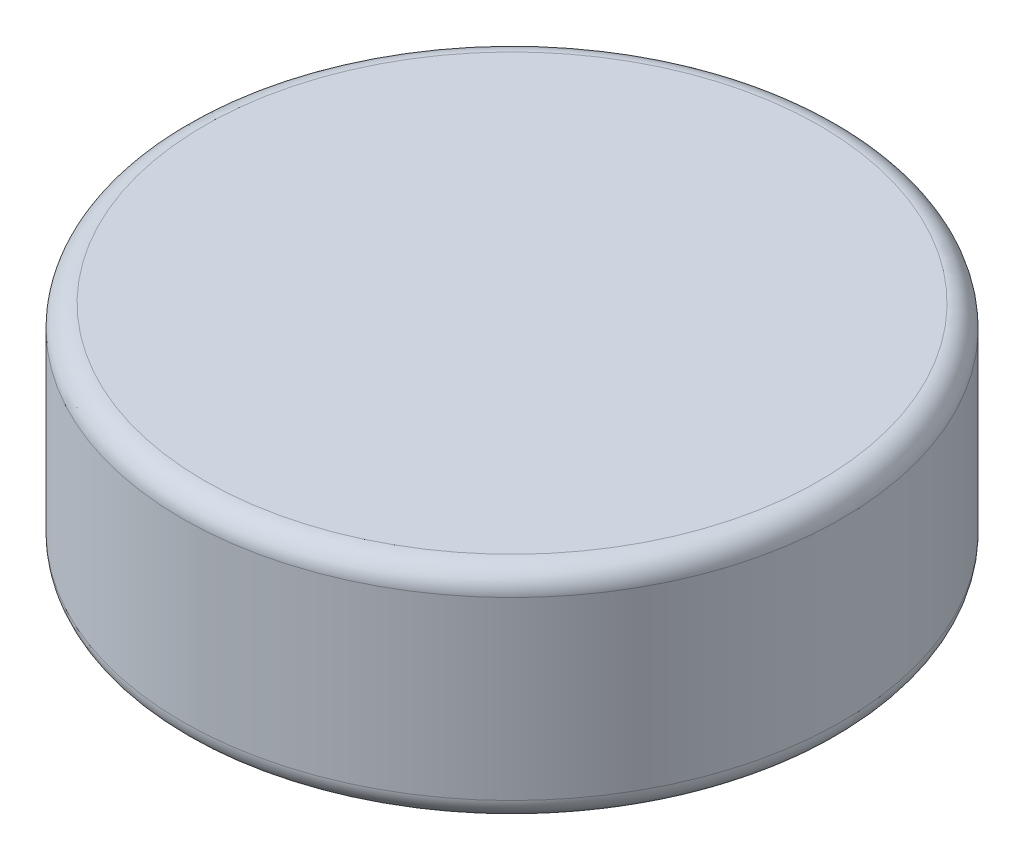
ISO-10303-21;
HEADER;
FILE_DESCRIPTION(('STEP AP214'),'2;1');
FILE_NAME('part.step','',(''),(''),'','','');
FILE_SCHEMA(('AUTOMOTIVE_DESIGN { 1 0 10303 214 1 1 1 1 }'));
ENDSEC;
DATA;
#1=APPLICATION_CONTEXT('core data for automotive mechanical design processes');
#2=APPLICATION_PROTOCOL_DEFINITION('international standard','automotive_design',2000,#1);
#3=PRODUCT_CONTEXT('',#1,'mechanical');
#4=PRODUCT('Part','Part','',(#3));
#5=PRODUCT_RELATED_PRODUCT_CATEGORY('part','',(#4));
#6=PRODUCT_DEFINITION_FORMATION('','',#4);
#7=PRODUCT_DEFINITION_CONTEXT('part definition',#1,'design');
#8=PRODUCT_DEFINITION('design','',#6,#7);
#9=PRODUCT_DEFINITION_SHAPE('','',#8);
#10=(LENGTH_UNIT() NAMED_UNIT(*) SI_UNIT(.MILLI.,.METRE.));
#11=(NAMED_UNIT(*) PLANE_ANGLE_UNIT() SI_UNIT($,.RADIAN.));
#12=(NAMED_UNIT(*) SI_UNIT($,.STERADIAN.) SOLID_ANGLE_UNIT());
#13=UNCERTAINTY_MEASURE_WITH_UNIT(LENGTH_MEASURE(1.E-05),#10,'distance_accuracy_value','');
#14=(GEOMETRIC_REPRESENTATION_CONTEXT(3) GLOBAL_UNCERTAINTY_ASSIGNED_CONTEXT((#13)) GLOBAL_UNIT_ASSIGNED_CONTEXT((#10,
#11,#12)) REPRESENTATION_CONTEXT('',''));
#15=CARTESIAN_POINT('',(0.,0.,0.));
#16=DIRECTION('',(0.,0.,1.));
#17=DIRECTION('',(1.,0.,0.));
#18=AXIS2_PLACEMENT_3D('',#15,#16,#17);
#19=CARTESIAN_POINT('',(0.,25.4,0.));
#20=DIRECTION('',(0.,-1.,0.));
#21=DIRECTION('',(0.,0.,-1.));
#22=AXIS2_PLACEMENT_3D('',#19,#20,#21);
#23=CYLINDRICAL_SURFACE('',#22,38.1);
#24=CARTESIAN_POINT('',(0.,2.54,0.));
#25=DIRECTION('',(0.,1.,0.));
#26=DIRECTION('',(0.,0.,1.));
#27=AXIS2_PLACEMENT_3D('',#24,#25,#26);
#28=CIRCLE('',#27,38.1);
#29=CARTESIAN_POINT('',(0.,2.54,38.1));
#30=VERTEX_POINT('',#29);
#31=EDGE_CURVE('E42',#30,#30,#28,.T.);
#32=ORIENTED_EDGE('',*,*,#31,.T.);
#33=EDGE_LOOP('',(#32));
#34=FACE_BOUND('',#33,.T.);
#35=CARTESIAN_POINT('',(0.,22.86,0.));
#36=DIRECTION('',(0.,1.,0.));
#37=DIRECTION('',(0.,0.,1.));
#38=AXIS2_PLACEMENT_3D('',#35,#36,#37);
#39=CIRCLE('',#38,38.1);
#40=CARTESIAN_POINT('',(0.,22.86,38.1));
#41=VERTEX_POINT('',#40);
#42=EDGE_CURVE('E46',#41,#41,#39,.F.);
#43=ORIENTED_EDGE('',*,*,#42,.T.);
#44=EDGE_LOOP('',(#43));
#45=FACE_BOUND('',#44,.T.);
#46=ADVANCED_FACE('F31',(#34,#45),#23,.T.);
#47=CARTESIAN_POINT('',(0.,25.4,0.));
#48=DIRECTION('',(0.,1.,0.));
#49=DIRECTION('',(0.,0.,1.));
#50=AXIS2_PLACEMENT_3D('',#47,#48,#49);
#51=PLANE('',#50);
#52=CARTESIAN_POINT('',(0.,25.4,0.));
#53=DIRECTION('',(0.,1.,0.));
#54=DIRECTION('',(0.,0.,1.));
#55=AXIS2_PLACEMENT_3D('',#52,#53,#54);
#56=CIRCLE('',#55,35.56);
#57=CARTESIAN_POINT('',(0.,25.4,35.56));
#58=VERTEX_POINT('',#57);
#59=EDGE_CURVE('E10',#58,#58,#56,.T.);
#60=ORIENTED_EDGE('',*,*,#59,.T.);
#61=EDGE_LOOP('',(#60));
#62=FACE_BOUND('',#61,.T.);
#63=ADVANCED_FACE('F62',(#62),#51,.T.);
#64=CARTESIAN_POINT('',(0.,0.,0.));
#65=DIRECTION('',(0.,1.,0.));
#66=DIRECTION('',(0.,0.,1.));
#67=AXIS2_PLACEMENT_3D('',#64,#65,#66);
#68=PLANE('',#67);
#69=CARTESIAN_POINT('',(0.,0.,0.));
#70=DIRECTION('',(0.,1.,0.));
#71=DIRECTION('',(0.,0.,1.));
#72=AXIS2_PLACEMENT_3D('',#69,#70,#71);
#73=CIRCLE('',#72,35.56);
#74=CARTESIAN_POINT('',(0.,0.,35.56));
#75=VERTEX_POINT('',#74);
#76=EDGE_CURVE('E38',#75,#75,#73,.F.);
#77=ORIENTED_EDGE('',*,*,#76,.T.);
#78=EDGE_LOOP('',(#77));
#79=FACE_BOUND('',#78,.T.);
#80=ADVANCED_FACE('F59',(#79),#68,.F.);
#81=CARTESIAN_POINT('',(0.,2.54,0.));
#82=DIRECTION('',(0.,1.,0.));
#83=DIRECTION('',(0.,0.,1.));
#84=AXIS2_PLACEMENT_3D('',#81,#82,#83);
#85=TOROIDAL_SURFACE('',#84,35.56,2.54);
#86=ORIENTED_EDGE('',*,*,#76,.F.);
#87=EDGE_LOOP('',(#86));
#88=FACE_BOUND('',#87,.T.);
#89=ORIENTED_EDGE('',*,*,#31,.F.);
#90=EDGE_LOOP('',(#89));
#91=FACE_BOUND('',#90,.T.);
#92=ADVANCED_FACE('F55',(#88,#91),#85,.T.);
#93=CARTESIAN_POINT('',(0.,22.86,0.));
#94=DIRECTION('',(0.,1.,0.));
#95=DIRECTION('',(0.,0.,1.));
#96=AXIS2_PLACEMENT_3D('',#93,#94,#95);
#97=TOROIDAL_SURFACE('',#96,35.56,2.54);
#98=ORIENTED_EDGE('',*,*,#42,.F.);
#99=EDGE_LOOP('',(#98));
#100=FACE_BOUND('',#99,.T.);
#101=ORIENTED_EDGE('',*,*,#59,.F.);
#102=EDGE_LOOP('',(#101));
#103=FACE_BOUND('',#102,.T.);
#104=ADVANCED_FACE('F33',(#100,#103),#97,.T.);
#105=CLOSED_SHELL('',(#46,#63,#80,#92,#104));
#106=MANIFOLD_SOLID_BREP('B2',#105);
#107=ADVANCED_BREP_SHAPE_REPRESENTATION('',(#18,#106),#14);
#108=SHAPE_DEFINITION_REPRESENTATION(#9,#107);
ENDSEC;
END-ISO-10303-21;
